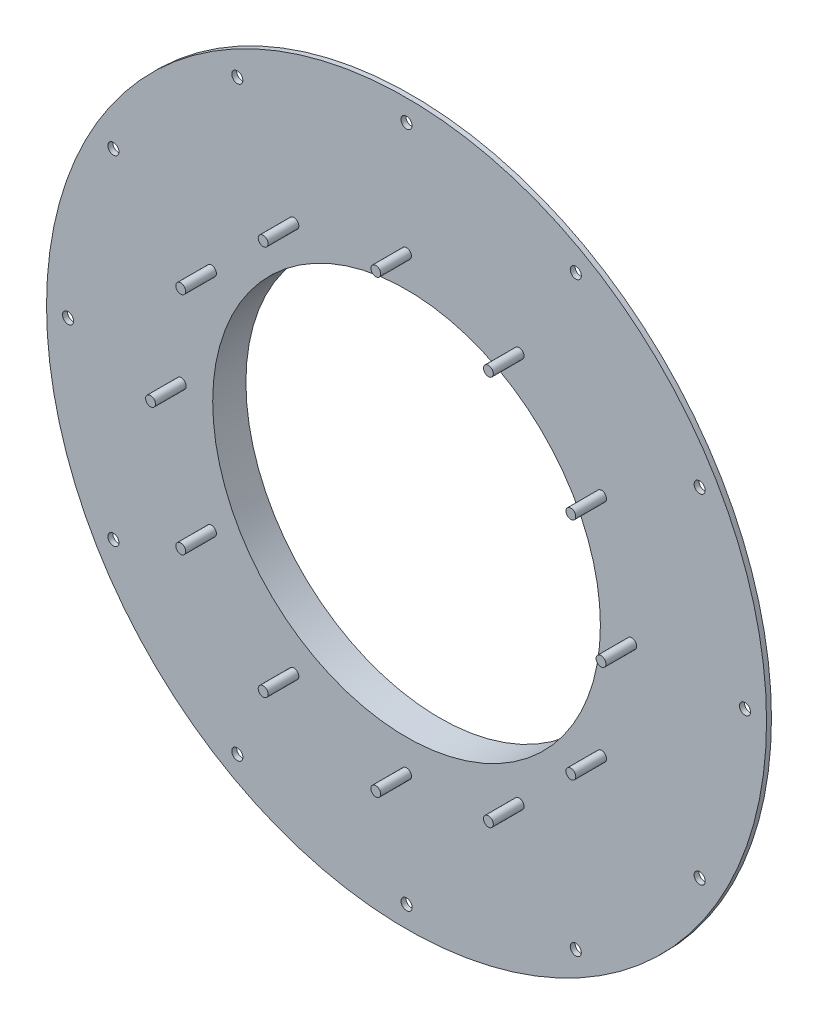
ISO-10303-21;
HEADER;
FILE_DESCRIPTION(('STEP AP214'),'2;1');
FILE_NAME('part.step','',(''),(''),'','','');
FILE_SCHEMA(('AUTOMOTIVE_DESIGN { 1 0 10303 214 1 1 1 1 }'));
ENDSEC;
DATA;
#1=APPLICATION_CONTEXT('core data for automotive mechanical design processes');
#2=APPLICATION_PROTOCOL_DEFINITION('international standard','automotive_design',2000,#1);
#3=PRODUCT_CONTEXT('',#1,'mechanical');
#4=PRODUCT('Part','Part','',(#3));
#5=PRODUCT_RELATED_PRODUCT_CATEGORY('part','',(#4));
#6=PRODUCT_DEFINITION_FORMATION('','',#4);
#7=PRODUCT_DEFINITION_CONTEXT('part definition',#1,'design');
#8=PRODUCT_DEFINITION('design','',#6,#7);
#9=PRODUCT_DEFINITION_SHAPE('','',#8);
#10=(LENGTH_UNIT() NAMED_UNIT(*) SI_UNIT(.MILLI.,.METRE.));
#11=(NAMED_UNIT(*) PLANE_ANGLE_UNIT() SI_UNIT($,.RADIAN.));
#12=(NAMED_UNIT(*) SI_UNIT($,.STERADIAN.) SOLID_ANGLE_UNIT());
#13=UNCERTAINTY_MEASURE_WITH_UNIT(LENGTH_MEASURE(1.E-05),#10,'distance_accuracy_value','');
#14=(GEOMETRIC_REPRESENTATION_CONTEXT(3) GLOBAL_UNCERTAINTY_ASSIGNED_CONTEXT((#13)) GLOBAL_UNIT_ASSIGNED_CONTEXT((#10,
#11,#12)) REPRESENTATION_CONTEXT('',''));
#15=CARTESIAN_POINT('',(0.,0.,0.));
#16=DIRECTION('',(0.,0.,1.));
#17=DIRECTION('',(1.,0.,0.));
#18=AXIS2_PLACEMENT_3D('',#15,#16,#17);
#19=CARTESIAN_POINT('',(0.,0.,0.));
#20=DIRECTION('',(0.,0.,1.));
#21=DIRECTION('',(1.,0.,0.));
#22=AXIS2_PLACEMENT_3D('',#19,#20,#21);
#23=PLANE('',#22);
#24=CARTESIAN_POINT('',(0.,0.,0.));
#25=DIRECTION('',(0.,0.,1.));
#26=DIRECTION('',(1.,0.,0.));
#27=AXIS2_PLACEMENT_3D('',#24,#25,#26);
#28=CIRCLE('',#27,292.5);
#29=CARTESIAN_POINT('',(292.5,0.,0.));
#30=VERTEX_POINT('',#29);
#31=EDGE_CURVE('E54',#30,#30,#28,.T.);
#32=ORIENTED_EDGE('',*,*,#31,.F.);
#33=EDGE_LOOP('',(#32));
#34=FACE_BOUND('',#33,.T.);
#35=CARTESIAN_POINT('',(0.,275.,0.));
#36=DIRECTION('',(0.,0.,1.));
#37=DIRECTION('',(1.,0.,0.));
#38=AXIS2_PLACEMENT_3D('',#35,#36,#37);
#39=CIRCLE('',#38,4.5);
#40=CARTESIAN_POINT('',(4.5,275.,0.));
#41=VERTEX_POINT('',#40);
#42=EDGE_CURVE('E63',#41,#41,#39,.T.);
#43=ORIENTED_EDGE('',*,*,#42,.T.);
#44=EDGE_LOOP('',(#43));
#45=FACE_BOUND('',#44,.T.);
#46=CARTESIAN_POINT('',(-137.5,238.15698604072,0.));
#47=DIRECTION('',(0.,0.,1.));
#48=DIRECTION('',(0.866025403784438,0.500000000000001,0.));
#49=AXIS2_PLACEMENT_3D('',#46,#47,#48);
#50=CIRCLE('',#49,4.5);
#51=CARTESIAN_POINT('',(-133.60288568297,240.40698604072,0.));
#52=VERTEX_POINT('',#51);
#53=EDGE_CURVE('E67',#52,#52,#50,.T.);
#54=ORIENTED_EDGE('',*,*,#53,.T.);
#55=EDGE_LOOP('',(#54));
#56=FACE_BOUND('',#55,.T.);
#57=CARTESIAN_POINT('',(137.499999999997,238.156986040722,0.));
#58=DIRECTION('',(0.,0.,1.));
#59=DIRECTION('',(0.866025403784445,-0.499999999999989,0.));
#60=AXIS2_PLACEMENT_3D('',#57,#58,#59);
#61=CIRCLE('',#60,4.5);
#62=CARTESIAN_POINT('',(141.397114317027,235.906986040722,0.));
#63=VERTEX_POINT('',#62);
#64=EDGE_CURVE('E127',#63,#63,#61,.T.);
#65=ORIENTED_EDGE('',*,*,#64,.T.);
#66=EDGE_LOOP('',(#65));
#67=FACE_BOUND('',#66,.T.);
#68=CARTESIAN_POINT('',(238.156986040719,137.500000000003,0.));
#69=DIRECTION('',(0.,0.,1.));
#70=DIRECTION('',(0.50000000000001,-0.866025403784433,0.));
#71=AXIS2_PLACEMENT_3D('',#68,#69,#70);
#72=CIRCLE('',#71,4.5);
#73=CARTESIAN_POINT('',(240.406986040719,133.602885682973,0.));
#74=VERTEX_POINT('',#73);
#75=EDGE_CURVE('E80',#74,#74,#72,.T.);
#76=ORIENTED_EDGE('',*,*,#75,.T.);
#77=EDGE_LOOP('',(#76));
#78=FACE_BOUND('',#77,.T.);
#79=CARTESIAN_POINT('',(275.,2.88047210454559E-12,0.));
#80=DIRECTION('',(0.,0.,1.));
#81=DIRECTION('',(0.,-1.,0.));
#82=AXIS2_PLACEMENT_3D('',#79,#80,#81);
#83=CIRCLE('',#82,4.5);
#84=CARTESIAN_POINT('',(275.,-4.49999999999712,0.));
#85=VERTEX_POINT('',#84);
#86=EDGE_CURVE('E79',#85,#85,#83,.T.);
#87=ORIENTED_EDGE('',*,*,#86,.T.);
#88=EDGE_LOOP('',(#87));
#89=FACE_BOUND('',#88,.T.);
#90=CARTESIAN_POINT('',(238.156986040722,-137.499999999998,0.));
#91=DIRECTION('',(0.,0.,1.));
#92=DIRECTION('',(-0.499999999999992,-0.866025403784443,0.));
#93=AXIS2_PLACEMENT_3D('',#90,#91,#92);
#94=CIRCLE('',#93,4.5);
#95=CARTESIAN_POINT('',(235.906986040722,-141.397114317028,0.));
#96=VERTEX_POINT('',#95);
#97=EDGE_CURVE('E86',#96,#96,#94,.T.);
#98=ORIENTED_EDGE('',*,*,#97,.T.);
#99=EDGE_LOOP('',(#98));
#100=FACE_BOUND('',#99,.T.);
#101=CARTESIAN_POINT('',(137.500000000002,-238.15698604072,0.));
#102=DIRECTION('',(0.,0.,1.));
#103=DIRECTION('',(-0.866025403784435,-0.500000000000007,0.));
#104=AXIS2_PLACEMENT_3D('',#101,#102,#103);
#105=CIRCLE('',#104,4.5);
#106=CARTESIAN_POINT('',(133.602885682972,-240.40698604072,0.));
#107=VERTEX_POINT('',#106);
#108=EDGE_CURVE('E92',#107,#107,#105,.T.);
#109=ORIENTED_EDGE('',*,*,#108,.T.);
#110=EDGE_LOOP('',(#109));
#111=FACE_BOUND('',#110,.T.);
#112=CARTESIAN_POINT('',(0.,-275.,0.));
#113=DIRECTION('',(0.,0.,1.));
#114=DIRECTION('',(-1.,0.,0.));
#115=AXIS2_PLACEMENT_3D('',#112,#113,#114);
#116=CIRCLE('',#115,4.5);
#117=CARTESIAN_POINT('',(-4.5,-275.,0.));
#118=VERTEX_POINT('',#117);
#119=EDGE_CURVE('E98',#118,#118,#116,.T.);
#120=ORIENTED_EDGE('',*,*,#119,.T.);
#121=EDGE_LOOP('',(#120));
#122=FACE_BOUND('',#121,.T.);
#123=CARTESIAN_POINT('',(-137.499999999999,-238.156986040721,0.));
#124=DIRECTION('',(0.,0.,1.));
#125=DIRECTION('',(-0.866025403784442,0.499999999999995,0.));
#126=AXIS2_PLACEMENT_3D('',#123,#124,#125);
#127=CIRCLE('',#126,4.5);
#128=CARTESIAN_POINT('',(-141.397114317029,-235.906986040722,0.));
#129=VERTEX_POINT('',#128);
#130=EDGE_CURVE('E104',#129,#129,#127,.T.);
#131=ORIENTED_EDGE('',*,*,#130,.T.);
#132=EDGE_LOOP('',(#131));
#133=FACE_BOUND('',#132,.T.);
#134=CARTESIAN_POINT('',(-238.15698604072,-137.500000000001,0.));
#135=DIRECTION('',(0.,0.,1.));
#136=DIRECTION('',(-0.500000000000004,0.866025403784436,0.));
#137=AXIS2_PLACEMENT_3D('',#134,#135,#136);
#138=CIRCLE('',#137,4.5);
#139=CARTESIAN_POINT('',(-240.40698604072,-133.602885682971,0.));
#140=VERTEX_POINT('',#139);
#141=EDGE_CURVE('E110',#140,#140,#138,.T.);
#142=ORIENTED_EDGE('',*,*,#141,.T.);
#143=EDGE_LOOP('',(#142));
#144=FACE_BOUND('',#143,.T.);
#145=CARTESIAN_POINT('',(-275.,-9.60157368181862E-13,0.));
#146=DIRECTION('',(0.,0.,1.));
#147=DIRECTION('',(0.,1.,0.));
#148=AXIS2_PLACEMENT_3D('',#145,#146,#147);
#149=CIRCLE('',#148,4.5);
#150=CARTESIAN_POINT('',(-275.,4.49999999999904,0.));
#151=VERTEX_POINT('',#150);
#152=EDGE_CURVE('E116',#151,#151,#149,.T.);
#153=ORIENTED_EDGE('',*,*,#152,.T.);
#154=EDGE_LOOP('',(#153));
#155=FACE_BOUND('',#154,.T.);
#156=CARTESIAN_POINT('',(-238.156986040721,137.499999999999,0.));
#157=DIRECTION('',(0.,0.,1.));
#158=DIRECTION('',(0.499999999999998,0.86602540378444,0.));
#159=AXIS2_PLACEMENT_3D('',#156,#157,#158);
#160=CIRCLE('',#159,4.5);
#161=CARTESIAN_POINT('',(-235.906986040721,141.397114317029,0.));
#162=VERTEX_POINT('',#161);
#163=EDGE_CURVE('E73',#162,#162,#160,.T.);
#164=ORIENTED_EDGE('',*,*,#163,.T.);
#165=EDGE_LOOP('',(#164));
#166=FACE_BOUND('',#165,.T.);
#167=CARTESIAN_POINT('',(0.,0.,0.));
#168=DIRECTION('',(0.,0.,1.));
#169=DIRECTION('',(1.,0.,0.));
#170=AXIS2_PLACEMENT_3D('',#167,#168,#169);
#171=CIRCLE('',#170,159.5);
#172=CARTESIAN_POINT('',(159.5,0.,0.));
#173=VERTEX_POINT('',#172);
#174=EDGE_CURVE('E11',#173,#173,#171,.F.);
#175=ORIENTED_EDGE('',*,*,#174,.F.);
#176=EDGE_LOOP('',(#175));
#177=FACE_BOUND('',#176,.T.);
#178=ADVANCED_FACE('F43',(#34,#45,#56,#67,#78,#89,#100,#111,#122,#133,#144,#155,#166,#177),#23,.F.);
#179=CARTESIAN_POINT('',(0.,0.,4.));
#180=DIRECTION('',(0.,0.,1.));
#181=DIRECTION('',(1.,0.,0.));
#182=AXIS2_PLACEMENT_3D('',#179,#180,#181);
#183=PLANE('',#182);
#184=CARTESIAN_POINT('',(91.499999999998,158.482648892553,4.));
#185=DIRECTION('',(0.,0.,1.));
#186=DIRECTION('',(0.866025403784445,-0.499999999999989,0.));
#187=AXIS2_PLACEMENT_3D('',#184,#185,#186);
#188=CIRCLE('',#187,4.);
#189=CARTESIAN_POINT('',(94.9641016151358,156.482648892553,4.));
#190=VERTEX_POINT('',#189);
#191=EDGE_CURVE('E202',#190,#190,#188,.T.);
#192=ORIENTED_EDGE('',*,*,#191,.F.);
#193=EDGE_LOOP('',(#192));
#194=FACE_BOUND('',#193,.T.);
#195=CARTESIAN_POINT('',(158.482648892551,91.5000000000018,4.));
#196=DIRECTION('',(0.,0.,1.));
#197=DIRECTION('',(0.50000000000001,-0.866025403784433,0.));
#198=AXIS2_PLACEMENT_3D('',#195,#196,#197);
#199=CIRCLE('',#198,4.);
#200=CARTESIAN_POINT('',(160.482648892551,88.0358983848641,4.));
#201=VERTEX_POINT('',#200);
#202=EDGE_CURVE('E196',#201,#201,#199,.T.);
#203=ORIENTED_EDGE('',*,*,#202,.F.);
#204=EDGE_LOOP('',(#203));
#205=FACE_BOUND('',#204,.T.);
#206=CARTESIAN_POINT('',(183.,1.91682325502488E-12,4.));
#207=DIRECTION('',(0.,0.,1.));
#208=DIRECTION('',(0.,-1.,0.));
#209=AXIS2_PLACEMENT_3D('',#206,#207,#208);
#210=CIRCLE('',#209,4.);
#211=CARTESIAN_POINT('',(183.,-3.99999999999809,4.));
#212=VERTEX_POINT('',#211);
#213=EDGE_CURVE('E190',#212,#212,#210,.T.);
#214=ORIENTED_EDGE('',*,*,#213,.F.);
#215=EDGE_LOOP('',(#214));
#216=FACE_BOUND('',#215,.T.);
#217=CARTESIAN_POINT('',(158.482648892553,-91.4999999999985,4.));
#218=DIRECTION('',(0.,0.,1.));
#219=DIRECTION('',(-0.499999999999992,-0.866025403784443,0.));
#220=AXIS2_PLACEMENT_3D('',#217,#218,#219);
#221=CIRCLE('',#220,4.);
#222=CARTESIAN_POINT('',(156.482648892553,-94.9641016151363,4.));
#223=VERTEX_POINT('',#222);
#224=EDGE_CURVE('E184',#223,#223,#221,.T.);
#225=ORIENTED_EDGE('',*,*,#224,.F.);
#226=EDGE_LOOP('',(#225));
#227=FACE_BOUND('',#226,.T.);
#228=CARTESIAN_POINT('',(91.5000000000013,-158.482648892552,4.));
#229=DIRECTION('',(0.,0.,1.));
#230=DIRECTION('',(-0.866025403784435,-0.500000000000007,0.));
#231=AXIS2_PLACEMENT_3D('',#228,#229,#230);
#232=CIRCLE('',#231,4.);
#233=CARTESIAN_POINT('',(88.0358983848636,-160.482648892552,4.));
#234=VERTEX_POINT('',#233);
#235=EDGE_CURVE('E178',#234,#234,#232,.T.);
#236=ORIENTED_EDGE('',*,*,#235,.F.);
#237=EDGE_LOOP('',(#236));
#238=FACE_BOUND('',#237,.T.);
#239=CARTESIAN_POINT('',(0.,-183.,4.));
#240=DIRECTION('',(0.,0.,1.));
#241=DIRECTION('',(-1.,0.,0.));
#242=AXIS2_PLACEMENT_3D('',#239,#240,#241);
#243=CIRCLE('',#242,4.);
#244=CARTESIAN_POINT('',(-4.,-183.,4.));
#245=VERTEX_POINT('',#244);
#246=EDGE_CURVE('E172',#245,#245,#243,.T.);
#247=ORIENTED_EDGE('',*,*,#246,.F.);
#248=EDGE_LOOP('',(#247));
#249=FACE_BOUND('',#248,.T.);
#250=CARTESIAN_POINT('',(-91.4999999999991,-158.482648892553,4.));
#251=DIRECTION('',(0.,0.,1.));
#252=DIRECTION('',(-0.866025403784442,0.499999999999995,0.));
#253=AXIS2_PLACEMENT_3D('',#250,#251,#252);
#254=CIRCLE('',#253,4.);
#255=CARTESIAN_POINT('',(-94.9641016151368,-156.482648892553,4.));
#256=VERTEX_POINT('',#255);
#257=EDGE_CURVE('E166',#256,#256,#254,.T.);
#258=ORIENTED_EDGE('',*,*,#257,.F.);
#259=EDGE_LOOP('',(#258));
#260=FACE_BOUND('',#259,.T.);
#261=CARTESIAN_POINT('',(-158.482648892552,-91.5000000000008,4.));
#262=DIRECTION('',(0.,0.,1.));
#263=DIRECTION('',(-0.500000000000004,0.866025403784436,0.));
#264=AXIS2_PLACEMENT_3D('',#261,#262,#263);
#265=CIRCLE('',#264,4.);
#266=CARTESIAN_POINT('',(-160.482648892552,-88.035898384863,4.));
#267=VERTEX_POINT('',#266);
#268=EDGE_CURVE('E160',#267,#267,#265,.T.);
#269=ORIENTED_EDGE('',*,*,#268,.F.);
#270=EDGE_LOOP('',(#269));
#271=FACE_BOUND('',#270,.T.);
#272=CARTESIAN_POINT('',(-183.,-6.38941085008293E-13,4.));
#273=DIRECTION('',(0.,0.,1.));
#274=DIRECTION('',(0.,1.,0.));
#275=AXIS2_PLACEMENT_3D('',#272,#273,#274);
#276=CIRCLE('',#275,4.);
#277=CARTESIAN_POINT('',(-183.,3.99999999999936,4.));
#278=VERTEX_POINT('',#277);
#279=EDGE_CURVE('E154',#278,#278,#276,.T.);
#280=ORIENTED_EDGE('',*,*,#279,.F.);
#281=EDGE_LOOP('',(#280));
#282=FACE_BOUND('',#281,.T.);
#283=CARTESIAN_POINT('',(-158.482648892552,91.4999999999996,4.));
#284=DIRECTION('',(0.,0.,1.));
#285=DIRECTION('',(0.499999999999998,0.86602540378444,0.));
#286=AXIS2_PLACEMENT_3D('',#283,#284,#285);
#287=CIRCLE('',#286,4.);
#288=CARTESIAN_POINT('',(-156.482648892552,94.9641016151374,4.));
#289=VERTEX_POINT('',#288);
#290=EDGE_CURVE('E148',#289,#289,#287,.T.);
#291=ORIENTED_EDGE('',*,*,#290,.F.);
#292=EDGE_LOOP('',(#291));
#293=FACE_BOUND('',#292,.T.);
#294=CARTESIAN_POINT('',(-91.5000000000002,158.482648892552,4.));
#295=DIRECTION('',(0.,0.,1.));
#296=DIRECTION('',(0.866025403784438,0.500000000000001,0.));
#297=AXIS2_PLACEMENT_3D('',#294,#295,#296);
#298=CIRCLE('',#297,4.);
#299=CARTESIAN_POINT('',(-88.0358983848624,160.482648892552,4.));
#300=VERTEX_POINT('',#299);
#301=EDGE_CURVE('E142',#300,#300,#298,.T.);
#302=ORIENTED_EDGE('',*,*,#301,.F.);
#303=EDGE_LOOP('',(#302));
#304=FACE_BOUND('',#303,.T.);
#305=CARTESIAN_POINT('',(0.,183.,4.));
#306=DIRECTION('',(0.,0.,1.));
#307=DIRECTION('',(1.,0.,0.));
#308=AXIS2_PLACEMENT_3D('',#305,#306,#307);
#309=CIRCLE('',#308,4.);
#310=CARTESIAN_POINT('',(4.,183.,4.));
#311=VERTEX_POINT('',#310);
#312=EDGE_CURVE('E136',#311,#311,#309,.T.);
#313=ORIENTED_EDGE('',*,*,#312,.F.);
#314=EDGE_LOOP('',(#313));
#315=FACE_BOUND('',#314,.T.);
#316=CARTESIAN_POINT('',(-238.156986040721,137.499999999999,4.));
#317=DIRECTION('',(0.,0.,1.));
#318=DIRECTION('',(0.499999999999998,0.86602540378444,0.));
#319=AXIS2_PLACEMENT_3D('',#316,#317,#318);
#320=CIRCLE('',#319,4.5);
#321=CARTESIAN_POINT('',(-235.906986040721,141.397114317029,4.));
#322=VERTEX_POINT('',#321);
#323=EDGE_CURVE('E119',#322,#322,#320,.T.);
#324=ORIENTED_EDGE('',*,*,#323,.F.);
#325=EDGE_LOOP('',(#324));
#326=FACE_BOUND('',#325,.T.);
#327=CARTESIAN_POINT('',(-275.,-9.60157368181862E-13,4.));
#328=DIRECTION('',(0.,0.,1.));
#329=DIRECTION('',(0.,1.,0.));
#330=AXIS2_PLACEMENT_3D('',#327,#328,#329);
#331=CIRCLE('',#330,4.5);
#332=CARTESIAN_POINT('',(-275.,4.49999999999904,4.));
#333=VERTEX_POINT('',#332);
#334=EDGE_CURVE('E113',#333,#333,#331,.T.);
#335=ORIENTED_EDGE('',*,*,#334,.F.);
#336=EDGE_LOOP('',(#335));
#337=FACE_BOUND('',#336,.T.);
#338=CARTESIAN_POINT('',(-238.15698604072,-137.500000000001,4.));
#339=DIRECTION('',(0.,0.,1.));
#340=DIRECTION('',(-0.500000000000004,0.866025403784436,0.));
#341=AXIS2_PLACEMENT_3D('',#338,#339,#340);
#342=CIRCLE('',#341,4.5);
#343=CARTESIAN_POINT('',(-240.40698604072,-133.602885682971,4.));
#344=VERTEX_POINT('',#343);
#345=EDGE_CURVE('E107',#344,#344,#342,.T.);
#346=ORIENTED_EDGE('',*,*,#345,.F.);
#347=EDGE_LOOP('',(#346));
#348=FACE_BOUND('',#347,.T.);
#349=CARTESIAN_POINT('',(-137.499999999999,-238.156986040721,4.));
#350=DIRECTION('',(0.,0.,1.));
#351=DIRECTION('',(-0.866025403784442,0.499999999999995,0.));
#352=AXIS2_PLACEMENT_3D('',#349,#350,#351);
#353=CIRCLE('',#352,4.5);
#354=CARTESIAN_POINT('',(-141.397114317029,-235.906986040722,4.));
#355=VERTEX_POINT('',#354);
#356=EDGE_CURVE('E101',#355,#355,#353,.T.);
#357=ORIENTED_EDGE('',*,*,#356,.F.);
#358=EDGE_LOOP('',(#357));
#359=FACE_BOUND('',#358,.T.);
#360=CARTESIAN_POINT('',(0.,-275.,4.));
#361=DIRECTION('',(0.,0.,1.));
#362=DIRECTION('',(-1.,0.,0.));
#363=AXIS2_PLACEMENT_3D('',#360,#361,#362);
#364=CIRCLE('',#363,4.5);
#365=CARTESIAN_POINT('',(-4.5,-275.,4.));
#366=VERTEX_POINT('',#365);
#367=EDGE_CURVE('E95',#366,#366,#364,.T.);
#368=ORIENTED_EDGE('',*,*,#367,.F.);
#369=EDGE_LOOP('',(#368));
#370=FACE_BOUND('',#369,.T.);
#371=CARTESIAN_POINT('',(137.500000000002,-238.15698604072,4.));
#372=DIRECTION('',(0.,0.,1.));
#373=DIRECTION('',(-0.866025403784435,-0.500000000000007,0.));
#374=AXIS2_PLACEMENT_3D('',#371,#372,#373);
#375=CIRCLE('',#374,4.5);
#376=CARTESIAN_POINT('',(133.602885682972,-240.40698604072,4.));
#377=VERTEX_POINT('',#376);
#378=EDGE_CURVE('E89',#377,#377,#375,.T.);
#379=ORIENTED_EDGE('',*,*,#378,.F.);
#380=EDGE_LOOP('',(#379));
#381=FACE_BOUND('',#380,.T.);
#382=CARTESIAN_POINT('',(238.156986040722,-137.499999999998,4.));
#383=DIRECTION('',(0.,0.,1.));
#384=DIRECTION('',(-0.499999999999992,-0.866025403784443,0.));
#385=AXIS2_PLACEMENT_3D('',#382,#383,#384);
#386=CIRCLE('',#385,4.5);
#387=CARTESIAN_POINT('',(235.906986040722,-141.397114317028,4.));
#388=VERTEX_POINT('',#387);
#389=EDGE_CURVE('E83',#388,#388,#386,.T.);
#390=ORIENTED_EDGE('',*,*,#389,.F.);
#391=EDGE_LOOP('',(#390));
#392=FACE_BOUND('',#391,.T.);
#393=CARTESIAN_POINT('',(275.,2.88047210454559E-12,4.));
#394=DIRECTION('',(0.,0.,1.));
#395=DIRECTION('',(0.,-1.,0.));
#396=AXIS2_PLACEMENT_3D('',#393,#394,#395);
#397=CIRCLE('',#396,4.5);
#398=CARTESIAN_POINT('',(275.,-4.49999999999712,4.));
#399=VERTEX_POINT('',#398);
#400=EDGE_CURVE('E76',#399,#399,#397,.T.);
#401=ORIENTED_EDGE('',*,*,#400,.F.);
#402=EDGE_LOOP('',(#401));
#403=FACE_BOUND('',#402,.T.);
#404=CARTESIAN_POINT('',(238.156986040719,137.500000000003,4.));
#405=DIRECTION('',(0.,0.,1.));
#406=DIRECTION('',(0.50000000000001,-0.866025403784433,0.));
#407=AXIS2_PLACEMENT_3D('',#404,#405,#406);
#408=CIRCLE('',#407,4.5);
#409=CARTESIAN_POINT('',(240.406986040719,133.602885682973,4.));
#410=VERTEX_POINT('',#409);
#411=EDGE_CURVE('E131',#410,#410,#408,.T.);
#412=ORIENTED_EDGE('',*,*,#411,.F.);
#413=EDGE_LOOP('',(#412));
#414=FACE_BOUND('',#413,.T.);
#415=CARTESIAN_POINT('',(137.499999999997,238.156986040722,4.));
#416=DIRECTION('',(0.,0.,1.));
#417=DIRECTION('',(0.866025403784445,-0.499999999999989,0.));
#418=AXIS2_PLACEMENT_3D('',#415,#416,#417);
#419=CIRCLE('',#418,4.5);
#420=CARTESIAN_POINT('',(141.397114317027,235.906986040722,4.));
#421=VERTEX_POINT('',#420);
#422=EDGE_CURVE('E124',#421,#421,#419,.T.);
#423=ORIENTED_EDGE('',*,*,#422,.F.);
#424=EDGE_LOOP('',(#423));
#425=FACE_BOUND('',#424,.T.);
#426=CARTESIAN_POINT('',(-137.5,238.15698604072,4.));
#427=DIRECTION('',(0.,0.,1.));
#428=DIRECTION('',(0.866025403784438,0.500000000000001,0.));
#429=AXIS2_PLACEMENT_3D('',#426,#427,#428);
#430=CIRCLE('',#429,4.5);
#431=CARTESIAN_POINT('',(-133.60288568297,240.40698604072,4.));
#432=VERTEX_POINT('',#431);
#433=EDGE_CURVE('E70',#432,#432,#430,.T.);
#434=ORIENTED_EDGE('',*,*,#433,.F.);
#435=EDGE_LOOP('',(#434));
#436=FACE_BOUND('',#435,.T.);
#437=CARTESIAN_POINT('',(0.,275.,4.));
#438=DIRECTION('',(0.,0.,1.));
#439=DIRECTION('',(1.,0.,0.));
#440=AXIS2_PLACEMENT_3D('',#437,#438,#439);
#441=CIRCLE('',#440,4.5);
#442=CARTESIAN_POINT('',(4.5,275.,4.));
#443=VERTEX_POINT('',#442);
#444=EDGE_CURVE('E64',#443,#443,#441,.T.);
#445=ORIENTED_EDGE('',*,*,#444,.F.);
#446=EDGE_LOOP('',(#445));
#447=FACE_BOUND('',#446,.T.);
#448=CARTESIAN_POINT('',(0.,0.,4.));
#449=DIRECTION('',(0.,0.,1.));
#450=DIRECTION('',(1.,0.,0.));
#451=AXIS2_PLACEMENT_3D('',#448,#449,#450);
#452=CIRCLE('',#451,292.5);
#453=CARTESIAN_POINT('',(292.5,0.,4.));
#454=VERTEX_POINT('',#453);
#455=EDGE_CURVE('E50',#454,#454,#452,.T.);
#456=ORIENTED_EDGE('',*,*,#455,.T.);
#457=EDGE_LOOP('',(#456));
#458=FACE_BOUND('',#457,.T.);
#459=CARTESIAN_POINT('',(0.,0.,4.));
#460=DIRECTION('',(0.,0.,1.));
#461=DIRECTION('',(1.,0.,0.));
#462=AXIS2_PLACEMENT_3D('',#459,#460,#461);
#463=CIRCLE('',#462,157.5);
#464=CARTESIAN_POINT('',(157.5,0.,4.));
#465=VERTEX_POINT('',#464);
#466=EDGE_CURVE('E59',#465,#465,#463,.T.);
#467=ORIENTED_EDGE('',*,*,#466,.F.);
#468=EDGE_LOOP('',(#467));
#469=FACE_BOUND('',#468,.T.);
#470=ADVANCED_FACE('F232',(#194,#205,#216,#227,#238,#249,#260,#271,#282,#293,#304,#315,#326,
#337,#348,#359,#370,#381,#392,#403,#414,#425,#436,#447,#458,#469),#183,.T.);
#471=CARTESIAN_POINT('',(0.,0.,4.));
#472=DIRECTION('',(0.,0.,-1.));
#473=DIRECTION('',(-1.,0.,0.));
#474=AXIS2_PLACEMENT_3D('',#471,#472,#473);
#475=CYLINDRICAL_SURFACE('',#474,292.5);
#476=ORIENTED_EDGE('',*,*,#455,.F.);
#477=EDGE_LOOP('',(#476));
#478=FACE_BOUND('',#477,.T.);
#479=ORIENTED_EDGE('',*,*,#31,.T.);
#480=EDGE_LOOP('',(#479));
#481=FACE_BOUND('',#480,.T.);
#482=ADVANCED_FACE('F45',(#478,#481),#475,.T.);
#483=CARTESIAN_POINT('',(0.,0.,4.));
#484=DIRECTION('',(0.,0.,-1.));
#485=DIRECTION('',(-1.,0.,0.));
#486=AXIS2_PLACEMENT_3D('',#483,#484,#485);
#487=CYLINDRICAL_SURFACE('',#486,157.5);
#488=ORIENTED_EDGE('',*,*,#466,.T.);
#489=EDGE_LOOP('',(#488));
#490=FACE_BOUND('',#489,.T.);
#491=CARTESIAN_POINT('',(0.,0.,-23.));
#492=DIRECTION('',(0.,0.,-1.));
#493=DIRECTION('',(-1.,0.,0.));
#494=AXIS2_PLACEMENT_3D('',#491,#492,#493);
#495=CIRCLE('',#494,157.5);
#496=CARTESIAN_POINT('',(-157.5,0.,-23.));
#497=VERTEX_POINT('',#496);
#498=EDGE_CURVE('E210',#497,#497,#495,.T.);
#499=ORIENTED_EDGE('',*,*,#498,.T.);
#500=EDGE_LOOP('',(#499));
#501=FACE_BOUND('',#500,.T.);
#502=ADVANCED_FACE('F214',(#490,#501),#487,.F.);
#503=CARTESIAN_POINT('',(0.,275.,0.));
#504=DIRECTION('',(0.,0.,1.));
#505=DIRECTION('',(1.,0.,0.));
#506=AXIS2_PLACEMENT_3D('',#503,#504,#505);
#507=CYLINDRICAL_SURFACE('',#506,4.5);
#508=ORIENTED_EDGE('',*,*,#42,.F.);
#509=EDGE_LOOP('',(#508));
#510=FACE_BOUND('',#509,.T.);
#511=ORIENTED_EDGE('',*,*,#444,.T.);
#512=EDGE_LOOP('',(#511));
#513=FACE_BOUND('',#512,.T.);
#514=ADVANCED_FACE('F244',(#510,#513),#507,.F.);
#515=CARTESIAN_POINT('',(-137.5,238.15698604072,0.));
#516=DIRECTION('',(0.,0.,1.));
#517=DIRECTION('',(1.,0.,0.));
#518=AXIS2_PLACEMENT_3D('',#515,#516,#517);
#519=CYLINDRICAL_SURFACE('',#518,4.5);
#520=ORIENTED_EDGE('',*,*,#53,.F.);
#521=EDGE_LOOP('',(#520));
#522=FACE_BOUND('',#521,.T.);
#523=ORIENTED_EDGE('',*,*,#433,.T.);
#524=EDGE_LOOP('',(#523));
#525=FACE_BOUND('',#524,.T.);
#526=ADVANCED_FACE('F248',(#522,#525),#519,.F.);
#527=CARTESIAN_POINT('',(137.499999999997,238.156986040722,0.));
#528=DIRECTION('',(0.,0.,1.));
#529=DIRECTION('',(1.,0.,0.));
#530=AXIS2_PLACEMENT_3D('',#527,#528,#529);
#531=CYLINDRICAL_SURFACE('',#530,4.5);
#532=ORIENTED_EDGE('',*,*,#64,.F.);
#533=EDGE_LOOP('',(#532));
#534=FACE_BOUND('',#533,.T.);
#535=ORIENTED_EDGE('',*,*,#422,.T.);
#536=EDGE_LOOP('',(#535));
#537=FACE_BOUND('',#536,.T.);
#538=ADVANCED_FACE('F252',(#534,#537),#531,.F.);
#539=CARTESIAN_POINT('',(238.156986040719,137.500000000003,0.));
#540=DIRECTION('',(0.,0.,1.));
#541=DIRECTION('',(1.,0.,0.));
#542=AXIS2_PLACEMENT_3D('',#539,#540,#541);
#543=CYLINDRICAL_SURFACE('',#542,4.5);
#544=ORIENTED_EDGE('',*,*,#75,.F.);
#545=EDGE_LOOP('',(#544));
#546=FACE_BOUND('',#545,.T.);
#547=ORIENTED_EDGE('',*,*,#411,.T.);
#548=EDGE_LOOP('',(#547));
#549=FACE_BOUND('',#548,.T.);
#550=ADVANCED_FACE('F258',(#546,#549),#543,.F.);
#551=CARTESIAN_POINT('',(275.,2.88047210454559E-12,0.));
#552=DIRECTION('',(0.,0.,1.));
#553=DIRECTION('',(1.,0.,0.));
#554=AXIS2_PLACEMENT_3D('',#551,#552,#553);
#555=CYLINDRICAL_SURFACE('',#554,4.5);
#556=ORIENTED_EDGE('',*,*,#86,.F.);
#557=EDGE_LOOP('',(#556));
#558=FACE_BOUND('',#557,.T.);
#559=ORIENTED_EDGE('',*,*,#400,.T.);
#560=EDGE_LOOP('',(#559));
#561=FACE_BOUND('',#560,.T.);
#562=ADVANCED_FACE('F254',(#558,#561),#555,.F.);
#563=CARTESIAN_POINT('',(238.156986040722,-137.499999999998,0.));
#564=DIRECTION('',(0.,0.,1.));
#565=DIRECTION('',(1.,0.,0.));
#566=AXIS2_PLACEMENT_3D('',#563,#564,#565);
#567=CYLINDRICAL_SURFACE('',#566,4.5);
#568=ORIENTED_EDGE('',*,*,#97,.F.);
#569=EDGE_LOOP('',(#568));
#570=FACE_BOUND('',#569,.T.);
#571=ORIENTED_EDGE('',*,*,#389,.T.);
#572=EDGE_LOOP('',(#571));
#573=FACE_BOUND('',#572,.T.);
#574=ADVANCED_FACE('F257',(#570,#573),#567,.F.);
#575=CARTESIAN_POINT('',(137.500000000002,-238.15698604072,0.));
#576=DIRECTION('',(0.,0.,1.));
#577=DIRECTION('',(1.,0.,0.));
#578=AXIS2_PLACEMENT_3D('',#575,#576,#577);
#579=CYLINDRICAL_SURFACE('',#578,4.5);
#580=ORIENTED_EDGE('',*,*,#108,.F.);
#581=EDGE_LOOP('',(#580));
#582=FACE_BOUND('',#581,.T.);
#583=ORIENTED_EDGE('',*,*,#378,.T.);
#584=EDGE_LOOP('',(#583));
#585=FACE_BOUND('',#584,.T.);
#586=ADVANCED_FACE('F262',(#582,#585),#579,.F.);
#587=CARTESIAN_POINT('',(0.,-275.,0.));
#588=DIRECTION('',(0.,0.,1.));
#589=DIRECTION('',(1.,0.,0.));
#590=AXIS2_PLACEMENT_3D('',#587,#588,#589);
#591=CYLINDRICAL_SURFACE('',#590,4.5);
#592=ORIENTED_EDGE('',*,*,#119,.F.);
#593=EDGE_LOOP('',(#592));
#594=FACE_BOUND('',#593,.T.);
#595=ORIENTED_EDGE('',*,*,#367,.T.);
#596=EDGE_LOOP('',(#595));
#597=FACE_BOUND('',#596,.T.);
#598=ADVANCED_FACE('F266',(#594,#597),#591,.F.);
#599=CARTESIAN_POINT('',(-137.499999999999,-238.156986040721,0.));
#600=DIRECTION('',(0.,0.,1.));
#601=DIRECTION('',(1.,0.,0.));
#602=AXIS2_PLACEMENT_3D('',#599,#600,#601);
#603=CYLINDRICAL_SURFACE('',#602,4.5);
#604=ORIENTED_EDGE('',*,*,#130,.F.);
#605=EDGE_LOOP('',(#604));
#606=FACE_BOUND('',#605,.T.);
#607=ORIENTED_EDGE('',*,*,#356,.T.);
#608=EDGE_LOOP('',(#607));
#609=FACE_BOUND('',#608,.T.);
#610=ADVANCED_FACE('F270',(#606,#609),#603,.F.);
#611=CARTESIAN_POINT('',(-238.15698604072,-137.500000000001,0.));
#612=DIRECTION('',(0.,0.,1.));
#613=DIRECTION('',(1.,0.,0.));
#614=AXIS2_PLACEMENT_3D('',#611,#612,#613);
#615=CYLINDRICAL_SURFACE('',#614,4.5);
#616=ORIENTED_EDGE('',*,*,#141,.F.);
#617=EDGE_LOOP('',(#616));
#618=FACE_BOUND('',#617,.T.);
#619=ORIENTED_EDGE('',*,*,#345,.T.);
#620=EDGE_LOOP('',(#619));
#621=FACE_BOUND('',#620,.T.);
#622=ADVANCED_FACE('F274',(#618,#621),#615,.F.);
#623=CARTESIAN_POINT('',(-275.,-9.60157368181862E-13,0.));
#624=DIRECTION('',(0.,0.,1.));
#625=DIRECTION('',(1.,0.,0.));
#626=AXIS2_PLACEMENT_3D('',#623,#624,#625);
#627=CYLINDRICAL_SURFACE('',#626,4.5);
#628=ORIENTED_EDGE('',*,*,#152,.F.);
#629=EDGE_LOOP('',(#628));
#630=FACE_BOUND('',#629,.T.);
#631=ORIENTED_EDGE('',*,*,#334,.T.);
#632=EDGE_LOOP('',(#631));
#633=FACE_BOUND('',#632,.T.);
#634=ADVANCED_FACE('F278',(#630,#633),#627,.F.);
#635=CARTESIAN_POINT('',(-238.156986040721,137.499999999999,0.));
#636=DIRECTION('',(0.,0.,1.));
#637=DIRECTION('',(1.,0.,0.));
#638=AXIS2_PLACEMENT_3D('',#635,#636,#637);
#639=CYLINDRICAL_SURFACE('',#638,4.5);
#640=ORIENTED_EDGE('',*,*,#163,.F.);
#641=EDGE_LOOP('',(#640));
#642=FACE_BOUND('',#641,.T.);
#643=ORIENTED_EDGE('',*,*,#323,.T.);
#644=EDGE_LOOP('',(#643));
#645=FACE_BOUND('',#644,.T.);
#646=ADVANCED_FACE('F282',(#642,#645),#639,.F.);
#647=CARTESIAN_POINT('',(0.,183.,29.));
#648=DIRECTION('',(0.,0.,-1.));
#649=DIRECTION('',(-1.,0.,0.));
#650=AXIS2_PLACEMENT_3D('',#647,#648,#649);
#651=CYLINDRICAL_SURFACE('',#650,4.);
#652=CARTESIAN_POINT('',(0.,183.,29.));
#653=DIRECTION('',(0.,0.,1.));
#654=DIRECTION('',(1.,0.,0.));
#655=AXIS2_PLACEMENT_3D('',#652,#653,#654);
#656=CIRCLE('',#655,4.);
#657=CARTESIAN_POINT('',(4.,183.,29.));
#658=VERTEX_POINT('',#657);
#659=EDGE_CURVE('E128',#658,#658,#656,.T.);
#660=ORIENTED_EDGE('',*,*,#659,.F.);
#661=EDGE_LOOP('',(#660));
#662=FACE_BOUND('',#661,.T.);
#663=ORIENTED_EDGE('',*,*,#312,.T.);
#664=EDGE_LOOP('',(#663));
#665=FACE_BOUND('',#664,.T.);
#666=ADVANCED_FACE('F286',(#662,#665),#651,.T.);
#667=CARTESIAN_POINT('',(0.,183.,29.));
#668=DIRECTION('',(0.,0.,1.));
#669=DIRECTION('',(1.,0.,0.));
#670=AXIS2_PLACEMENT_3D('',#667,#668,#669);
#671=PLANE('',#670);
#672=ORIENTED_EDGE('',*,*,#659,.T.);
#673=EDGE_LOOP('',(#672));
#674=FACE_BOUND('',#673,.T.);
#675=ADVANCED_FACE('F296',(#674),#671,.T.);
#676=CARTESIAN_POINT('',(-91.5000000000002,158.482648892552,29.));
#677=DIRECTION('',(0.,0.,-1.));
#678=DIRECTION('',(-1.,0.,0.));
#679=AXIS2_PLACEMENT_3D('',#676,#677,#678);
#680=CYLINDRICAL_SURFACE('',#679,4.);
#681=CARTESIAN_POINT('',(-91.5000000000002,158.482648892552,29.));
#682=DIRECTION('',(0.,0.,1.));
#683=DIRECTION('',(0.866025403784438,0.500000000000001,0.));
#684=AXIS2_PLACEMENT_3D('',#681,#682,#683);
#685=CIRCLE('',#684,4.);
#686=CARTESIAN_POINT('',(-88.0358983848624,160.482648892552,29.));
#687=VERTEX_POINT('',#686);
#688=EDGE_CURVE('E139',#687,#687,#685,.T.);
#689=ORIENTED_EDGE('',*,*,#688,.F.);
#690=EDGE_LOOP('',(#689));
#691=FACE_BOUND('',#690,.T.);
#692=ORIENTED_EDGE('',*,*,#301,.T.);
#693=EDGE_LOOP('',(#692));
#694=FACE_BOUND('',#693,.T.);
#695=ADVANCED_FACE('F300',(#691,#694),#680,.T.);
#696=CARTESIAN_POINT('',(-91.5000000000002,158.482648892552,29.));
#697=DIRECTION('',(0.,0.,1.));
#698=DIRECTION('',(0.866025403784438,0.500000000000001,0.));
#699=AXIS2_PLACEMENT_3D('',#696,#697,#698);
#700=PLANE('',#699);
#701=ORIENTED_EDGE('',*,*,#688,.T.);
#702=EDGE_LOOP('',(#701));
#703=FACE_BOUND('',#702,.T.);
#704=ADVANCED_FACE('F304',(#703),#700,.T.);
#705=CARTESIAN_POINT('',(-158.482648892552,91.4999999999996,29.));
#706=DIRECTION('',(0.,0.,-1.));
#707=DIRECTION('',(-1.,0.,0.));
#708=AXIS2_PLACEMENT_3D('',#705,#706,#707);
#709=CYLINDRICAL_SURFACE('',#708,4.);
#710=CARTESIAN_POINT('',(-158.482648892552,91.4999999999996,29.));
#711=DIRECTION('',(0.,0.,1.));
#712=DIRECTION('',(0.499999999999998,0.86602540378444,0.));
#713=AXIS2_PLACEMENT_3D('',#710,#711,#712);
#714=CIRCLE('',#713,4.);
#715=CARTESIAN_POINT('',(-156.482648892552,94.9641016151374,29.));
#716=VERTEX_POINT('',#715);
#717=EDGE_CURVE('E145',#716,#716,#714,.T.);
#718=ORIENTED_EDGE('',*,*,#717,.F.);
#719=EDGE_LOOP('',(#718));
#720=FACE_BOUND('',#719,.T.);
#721=ORIENTED_EDGE('',*,*,#290,.T.);
#722=EDGE_LOOP('',(#721));
#723=FACE_BOUND('',#722,.T.);
#724=ADVANCED_FACE('F308',(#720,#723),#709,.T.);
#725=CARTESIAN_POINT('',(-158.482648892552,91.4999999999996,29.));
#726=DIRECTION('',(0.,0.,1.));
#727=DIRECTION('',(0.499999999999998,0.86602540378444,0.));
#728=AXIS2_PLACEMENT_3D('',#725,#726,#727);
#729=PLANE('',#728);
#730=ORIENTED_EDGE('',*,*,#717,.T.);
#731=EDGE_LOOP('',(#730));
#732=FACE_BOUND('',#731,.T.);
#733=ADVANCED_FACE('F312',(#732),#729,.T.);
#734=CARTESIAN_POINT('',(-183.,-6.38941085008293E-13,29.));
#735=DIRECTION('',(0.,0.,-1.));
#736=DIRECTION('',(-1.,0.,0.));
#737=AXIS2_PLACEMENT_3D('',#734,#735,#736);
#738=CYLINDRICAL_SURFACE('',#737,4.);
#739=CARTESIAN_POINT('',(-183.,-6.38941085008293E-13,29.));
#740=DIRECTION('',(0.,0.,1.));
#741=DIRECTION('',(0.,1.,0.));
#742=AXIS2_PLACEMENT_3D('',#739,#740,#741);
#743=CIRCLE('',#742,4.);
#744=CARTESIAN_POINT('',(-183.,3.99999999999936,29.));
#745=VERTEX_POINT('',#744);
#746=EDGE_CURVE('E151',#745,#745,#743,.T.);
#747=ORIENTED_EDGE('',*,*,#746,.F.);
#748=EDGE_LOOP('',(#747));
#749=FACE_BOUND('',#748,.T.);
#750=ORIENTED_EDGE('',*,*,#279,.T.);
#751=EDGE_LOOP('',(#750));
#752=FACE_BOUND('',#751,.T.);
#753=ADVANCED_FACE('F316',(#749,#752),#738,.T.);
#754=CARTESIAN_POINT('',(-183.,-6.38941085008293E-13,29.));
#755=DIRECTION('',(0.,0.,1.));
#756=DIRECTION('',(0.,1.,0.));
#757=AXIS2_PLACEMENT_3D('',#754,#755,#756);
#758=PLANE('',#757);
#759=ORIENTED_EDGE('',*,*,#746,.T.);
#760=EDGE_LOOP('',(#759));
#761=FACE_BOUND('',#760,.T.);
#762=ADVANCED_FACE('F320',(#761),#758,.T.);
#763=CARTESIAN_POINT('',(-158.482648892552,-91.5000000000008,29.));
#764=DIRECTION('',(0.,0.,-1.));
#765=DIRECTION('',(-1.,0.,0.));
#766=AXIS2_PLACEMENT_3D('',#763,#764,#765);
#767=CYLINDRICAL_SURFACE('',#766,4.);
#768=CARTESIAN_POINT('',(-158.482648892552,-91.5000000000008,29.));
#769=DIRECTION('',(0.,0.,1.));
#770=DIRECTION('',(-0.500000000000004,0.866025403784436,0.));
#771=AXIS2_PLACEMENT_3D('',#768,#769,#770);
#772=CIRCLE('',#771,4.);
#773=CARTESIAN_POINT('',(-160.482648892552,-88.035898384863,29.));
#774=VERTEX_POINT('',#773);
#775=EDGE_CURVE('E157',#774,#774,#772,.T.);
#776=ORIENTED_EDGE('',*,*,#775,.F.);
#777=EDGE_LOOP('',(#776));
#778=FACE_BOUND('',#777,.T.);
#779=ORIENTED_EDGE('',*,*,#268,.T.);
#780=EDGE_LOOP('',(#779));
#781=FACE_BOUND('',#780,.T.);
#782=ADVANCED_FACE('F324',(#778,#781),#767,.T.);
#783=CARTESIAN_POINT('',(-158.482648892552,-91.5000000000008,29.));
#784=DIRECTION('',(0.,0.,1.));
#785=DIRECTION('',(-0.500000000000004,0.866025403784436,0.));
#786=AXIS2_PLACEMENT_3D('',#783,#784,#785);
#787=PLANE('',#786);
#788=ORIENTED_EDGE('',*,*,#775,.T.);
#789=EDGE_LOOP('',(#788));
#790=FACE_BOUND('',#789,.T.);
#791=ADVANCED_FACE('F328',(#790),#787,.T.);
#792=CARTESIAN_POINT('',(-91.4999999999991,-158.482648892553,29.));
#793=DIRECTION('',(0.,0.,-1.));
#794=DIRECTION('',(-1.,0.,0.));
#795=AXIS2_PLACEMENT_3D('',#792,#793,#794);
#796=CYLINDRICAL_SURFACE('',#795,4.);
#797=CARTESIAN_POINT('',(-91.4999999999991,-158.482648892553,29.));
#798=DIRECTION('',(0.,0.,1.));
#799=DIRECTION('',(-0.866025403784442,0.499999999999995,0.));
#800=AXIS2_PLACEMENT_3D('',#797,#798,#799);
#801=CIRCLE('',#800,4.);
#802=CARTESIAN_POINT('',(-94.9641016151368,-156.482648892553,29.));
#803=VERTEX_POINT('',#802);
#804=EDGE_CURVE('E163',#803,#803,#801,.T.);
#805=ORIENTED_EDGE('',*,*,#804,.F.);
#806=EDGE_LOOP('',(#805));
#807=FACE_BOUND('',#806,.T.);
#808=ORIENTED_EDGE('',*,*,#257,.T.);
#809=EDGE_LOOP('',(#808));
#810=FACE_BOUND('',#809,.T.);
#811=ADVANCED_FACE('F332',(#807,#810),#796,.T.);
#812=CARTESIAN_POINT('',(-91.4999999999991,-158.482648892553,29.));
#813=DIRECTION('',(0.,0.,1.));
#814=DIRECTION('',(-0.866025403784442,0.499999999999995,0.));
#815=AXIS2_PLACEMENT_3D('',#812,#813,#814);
#816=PLANE('',#815);
#817=ORIENTED_EDGE('',*,*,#804,.T.);
#818=EDGE_LOOP('',(#817));
#819=FACE_BOUND('',#818,.T.);
#820=ADVANCED_FACE('F336',(#819),#816,.T.);
#821=CARTESIAN_POINT('',(0.,-183.,29.));
#822=DIRECTION('',(0.,0.,-1.));
#823=DIRECTION('',(-1.,0.,0.));
#824=AXIS2_PLACEMENT_3D('',#821,#822,#823);
#825=CYLINDRICAL_SURFACE('',#824,4.);
#826=CARTESIAN_POINT('',(0.,-183.,29.));
#827=DIRECTION('',(0.,0.,1.));
#828=DIRECTION('',(-1.,0.,0.));
#829=AXIS2_PLACEMENT_3D('',#826,#827,#828);
#830=CIRCLE('',#829,4.);
#831=CARTESIAN_POINT('',(-4.,-183.,29.));
#832=VERTEX_POINT('',#831);
#833=EDGE_CURVE('E169',#832,#832,#830,.T.);
#834=ORIENTED_EDGE('',*,*,#833,.F.);
#835=EDGE_LOOP('',(#834));
#836=FACE_BOUND('',#835,.T.);
#837=ORIENTED_EDGE('',*,*,#246,.T.);
#838=EDGE_LOOP('',(#837));
#839=FACE_BOUND('',#838,.T.);
#840=ADVANCED_FACE('F340',(#836,#839),#825,.T.);
#841=CARTESIAN_POINT('',(0.,-183.,29.));
#842=DIRECTION('',(0.,0.,1.));
#843=DIRECTION('',(-1.,0.,0.));
#844=AXIS2_PLACEMENT_3D('',#841,#842,#843);
#845=PLANE('',#844);
#846=ORIENTED_EDGE('',*,*,#833,.T.);
#847=EDGE_LOOP('',(#846));
#848=FACE_BOUND('',#847,.T.);
#849=ADVANCED_FACE('F344',(#848),#845,.T.);
#850=CARTESIAN_POINT('',(91.5000000000013,-158.482648892552,29.));
#851=DIRECTION('',(0.,0.,-1.));
#852=DIRECTION('',(-1.,0.,0.));
#853=AXIS2_PLACEMENT_3D('',#850,#851,#852);
#854=CYLINDRICAL_SURFACE('',#853,4.);
#855=CARTESIAN_POINT('',(91.5000000000013,-158.482648892552,29.));
#856=DIRECTION('',(0.,0.,1.));
#857=DIRECTION('',(-0.866025403784435,-0.500000000000007,0.));
#858=AXIS2_PLACEMENT_3D('',#855,#856,#857);
#859=CIRCLE('',#858,4.);
#860=CARTESIAN_POINT('',(88.0358983848636,-160.482648892552,29.));
#861=VERTEX_POINT('',#860);
#862=EDGE_CURVE('E175',#861,#861,#859,.T.);
#863=ORIENTED_EDGE('',*,*,#862,.F.);
#864=EDGE_LOOP('',(#863));
#865=FACE_BOUND('',#864,.T.);
#866=ORIENTED_EDGE('',*,*,#235,.T.);
#867=EDGE_LOOP('',(#866));
#868=FACE_BOUND('',#867,.T.);
#869=ADVANCED_FACE('F348',(#865,#868),#854,.T.);
#870=CARTESIAN_POINT('',(91.5000000000013,-158.482648892552,29.));
#871=DIRECTION('',(0.,0.,1.));
#872=DIRECTION('',(-0.866025403784435,-0.500000000000007,0.));
#873=AXIS2_PLACEMENT_3D('',#870,#871,#872);
#874=PLANE('',#873);
#875=ORIENTED_EDGE('',*,*,#862,.T.);
#876=EDGE_LOOP('',(#875));
#877=FACE_BOUND('',#876,.T.);
#878=ADVANCED_FACE('F352',(#877),#874,.T.);
#879=CARTESIAN_POINT('',(158.482648892553,-91.4999999999985,29.));
#880=DIRECTION('',(0.,0.,-1.));
#881=DIRECTION('',(-1.,0.,0.));
#882=AXIS2_PLACEMENT_3D('',#879,#880,#881);
#883=CYLINDRICAL_SURFACE('',#882,4.);
#884=CARTESIAN_POINT('',(158.482648892553,-91.4999999999985,29.));
#885=DIRECTION('',(0.,0.,1.));
#886=DIRECTION('',(-0.499999999999992,-0.866025403784443,0.));
#887=AXIS2_PLACEMENT_3D('',#884,#885,#886);
#888=CIRCLE('',#887,4.);
#889=CARTESIAN_POINT('',(156.482648892553,-94.9641016151363,29.));
#890=VERTEX_POINT('',#889);
#891=EDGE_CURVE('E181',#890,#890,#888,.T.);
#892=ORIENTED_EDGE('',*,*,#891,.F.);
#893=EDGE_LOOP('',(#892));
#894=FACE_BOUND('',#893,.T.);
#895=ORIENTED_EDGE('',*,*,#224,.T.);
#896=EDGE_LOOP('',(#895));
#897=FACE_BOUND('',#896,.T.);
#898=ADVANCED_FACE('F356',(#894,#897),#883,.T.);
#899=CARTESIAN_POINT('',(158.482648892553,-91.4999999999985,29.));
#900=DIRECTION('',(0.,0.,1.));
#901=DIRECTION('',(-0.499999999999992,-0.866025403784443,0.));
#902=AXIS2_PLACEMENT_3D('',#899,#900,#901);
#903=PLANE('',#902);
#904=ORIENTED_EDGE('',*,*,#891,.T.);
#905=EDGE_LOOP('',(#904));
#906=FACE_BOUND('',#905,.T.);
#907=ADVANCED_FACE('F360',(#906),#903,.T.);
#908=CARTESIAN_POINT('',(183.,1.91682325502488E-12,29.));
#909=DIRECTION('',(0.,0.,-1.));
#910=DIRECTION('',(-1.,0.,0.));
#911=AXIS2_PLACEMENT_3D('',#908,#909,#910);
#912=CYLINDRICAL_SURFACE('',#911,4.);
#913=CARTESIAN_POINT('',(183.,1.91682325502488E-12,29.));
#914=DIRECTION('',(0.,0.,1.));
#915=DIRECTION('',(0.,-1.,0.));
#916=AXIS2_PLACEMENT_3D('',#913,#914,#915);
#917=CIRCLE('',#916,4.);
#918=CARTESIAN_POINT('',(183.,-3.99999999999809,29.));
#919=VERTEX_POINT('',#918);
#920=EDGE_CURVE('E187',#919,#919,#917,.T.);
#921=ORIENTED_EDGE('',*,*,#920,.F.);
#922=EDGE_LOOP('',(#921));
#923=FACE_BOUND('',#922,.T.);
#924=ORIENTED_EDGE('',*,*,#213,.T.);
#925=EDGE_LOOP('',(#924));
#926=FACE_BOUND('',#925,.T.);
#927=ADVANCED_FACE('F364',(#923,#926),#912,.T.);
#928=CARTESIAN_POINT('',(183.,1.91682325502488E-12,29.));
#929=DIRECTION('',(0.,0.,1.));
#930=DIRECTION('',(0.,-1.,0.));
#931=AXIS2_PLACEMENT_3D('',#928,#929,#930);
#932=PLANE('',#931);
#933=ORIENTED_EDGE('',*,*,#920,.T.);
#934=EDGE_LOOP('',(#933));
#935=FACE_BOUND('',#934,.T.);
#936=ADVANCED_FACE('F368',(#935),#932,.T.);
#937=CARTESIAN_POINT('',(158.482648892551,91.5000000000018,29.));
#938=DIRECTION('',(0.,0.,-1.));
#939=DIRECTION('',(-1.,0.,0.));
#940=AXIS2_PLACEMENT_3D('',#937,#938,#939);
#941=CYLINDRICAL_SURFACE('',#940,4.);
#942=CARTESIAN_POINT('',(158.482648892551,91.5000000000018,29.));
#943=DIRECTION('',(0.,0.,1.));
#944=DIRECTION('',(0.50000000000001,-0.866025403784433,0.));
#945=AXIS2_PLACEMENT_3D('',#942,#943,#944);
#946=CIRCLE('',#945,4.);
#947=CARTESIAN_POINT('',(160.482648892551,88.0358983848641,29.));
#948=VERTEX_POINT('',#947);
#949=EDGE_CURVE('E193',#948,#948,#946,.T.);
#950=ORIENTED_EDGE('',*,*,#949,.F.);
#951=EDGE_LOOP('',(#950));
#952=FACE_BOUND('',#951,.T.);
#953=ORIENTED_EDGE('',*,*,#202,.T.);
#954=EDGE_LOOP('',(#953));
#955=FACE_BOUND('',#954,.T.);
#956=ADVANCED_FACE('F372',(#952,#955),#941,.T.);
#957=CARTESIAN_POINT('',(158.482648892551,91.5000000000018,29.));
#958=DIRECTION('',(0.,0.,1.));
#959=DIRECTION('',(0.50000000000001,-0.866025403784433,0.));
#960=AXIS2_PLACEMENT_3D('',#957,#958,#959);
#961=PLANE('',#960);
#962=ORIENTED_EDGE('',*,*,#949,.T.);
#963=EDGE_LOOP('',(#962));
#964=FACE_BOUND('',#963,.T.);
#965=ADVANCED_FACE('F376',(#964),#961,.T.);
#966=CARTESIAN_POINT('',(91.499999999998,158.482648892553,29.));
#967=DIRECTION('',(0.,0.,-1.));
#968=DIRECTION('',(-1.,0.,0.));
#969=AXIS2_PLACEMENT_3D('',#966,#967,#968);
#970=CYLINDRICAL_SURFACE('',#969,4.);
#971=CARTESIAN_POINT('',(91.499999999998,158.482648892553,29.));
#972=DIRECTION('',(0.,0.,1.));
#973=DIRECTION('',(0.866025403784445,-0.499999999999989,0.));
#974=AXIS2_PLACEMENT_3D('',#971,#972,#973);
#975=CIRCLE('',#974,4.);
#976=CARTESIAN_POINT('',(94.9641016151358,156.482648892553,29.));
#977=VERTEX_POINT('',#976);
#978=EDGE_CURVE('E199',#977,#977,#975,.T.);
#979=ORIENTED_EDGE('',*,*,#978,.F.);
#980=EDGE_LOOP('',(#979));
#981=FACE_BOUND('',#980,.T.);
#982=ORIENTED_EDGE('',*,*,#191,.T.);
#983=EDGE_LOOP('',(#982));
#984=FACE_BOUND('',#983,.T.);
#985=ADVANCED_FACE('F228',(#981,#984),#970,.T.);
#986=CARTESIAN_POINT('',(91.499999999998,158.482648892553,29.));
#987=DIRECTION('',(0.,0.,1.));
#988=DIRECTION('',(0.866025403784445,-0.499999999999989,0.));
#989=AXIS2_PLACEMENT_3D('',#986,#987,#988);
#990=PLANE('',#989);
#991=ORIENTED_EDGE('',*,*,#978,.T.);
#992=EDGE_LOOP('',(#991));
#993=FACE_BOUND('',#992,.T.);
#994=ADVANCED_FACE('F219',(#993),#990,.T.);
#995=CARTESIAN_POINT('',(0.,0.,-23.));
#996=DIRECTION('',(0.,0.,-1.));
#997=DIRECTION('',(-1.,0.,0.));
#998=AXIS2_PLACEMENT_3D('',#995,#996,#997);
#999=PLANE('',#998);
#1000=CARTESIAN_POINT('',(0.,0.,-23.));
#1001=DIRECTION('',(0.,0.,-1.));
#1002=DIRECTION('',(-1.,0.,0.));
#1003=AXIS2_PLACEMENT_3D('',#1000,#1001,#1002);
#1004=CIRCLE('',#1003,159.5);
#1005=CARTESIAN_POINT('',(-159.5,0.,-23.));
#1006=VERTEX_POINT('',#1005);
#1007=EDGE_CURVE('E205',#1006,#1006,#1004,.T.);
#1008=ORIENTED_EDGE('',*,*,#1007,.T.);
#1009=EDGE_LOOP('',(#1008));
#1010=FACE_BOUND('',#1009,.T.);
#1011=ORIENTED_EDGE('',*,*,#498,.F.);
#1012=EDGE_LOOP('',(#1011));
#1013=FACE_BOUND('',#1012,.T.);
#1014=ADVANCED_FACE('F216',(#1010,#1013),#999,.T.);
#1015=CARTESIAN_POINT('',(0.,0.,-23.));
#1016=DIRECTION('',(0.,0.,1.));
#1017=DIRECTION('',(1.,0.,0.));
#1018=AXIS2_PLACEMENT_3D('',#1015,#1016,#1017);
#1019=CYLINDRICAL_SURFACE('',#1018,159.5);
#1020=ORIENTED_EDGE('',*,*,#1007,.F.);
#1021=EDGE_LOOP('',(#1020));
#1022=FACE_BOUND('',#1021,.T.);
#1023=ORIENTED_EDGE('',*,*,#174,.T.);
#1024=EDGE_LOOP('',(#1023));
#1025=FACE_BOUND('',#1024,.T.);
#1026=ADVANCED_FACE('F218',(#1022,#1025),#1019,.T.);
#1027=CLOSED_SHELL('',(#178,#470,#482,#502,#514,#526,#538,#550,#562,#574,#586,#598,#610,#622,
#634,#646,#666,#675,#695,#704,#724,#733,#753,#762,#782,#791,#811,#820,#840,#849,#869,#878,#898,
#907,#927,#936,#956,#965,#985,#994,#1014,#1026));
#1028=MANIFOLD_SOLID_BREP('B2',#1027);
#1029=ADVANCED_BREP_SHAPE_REPRESENTATION('',(#18,#1028),#14);
#1030=SHAPE_DEFINITION_REPRESENTATION(#9,#1029);
ENDSEC;
END-ISO-10303-21;
